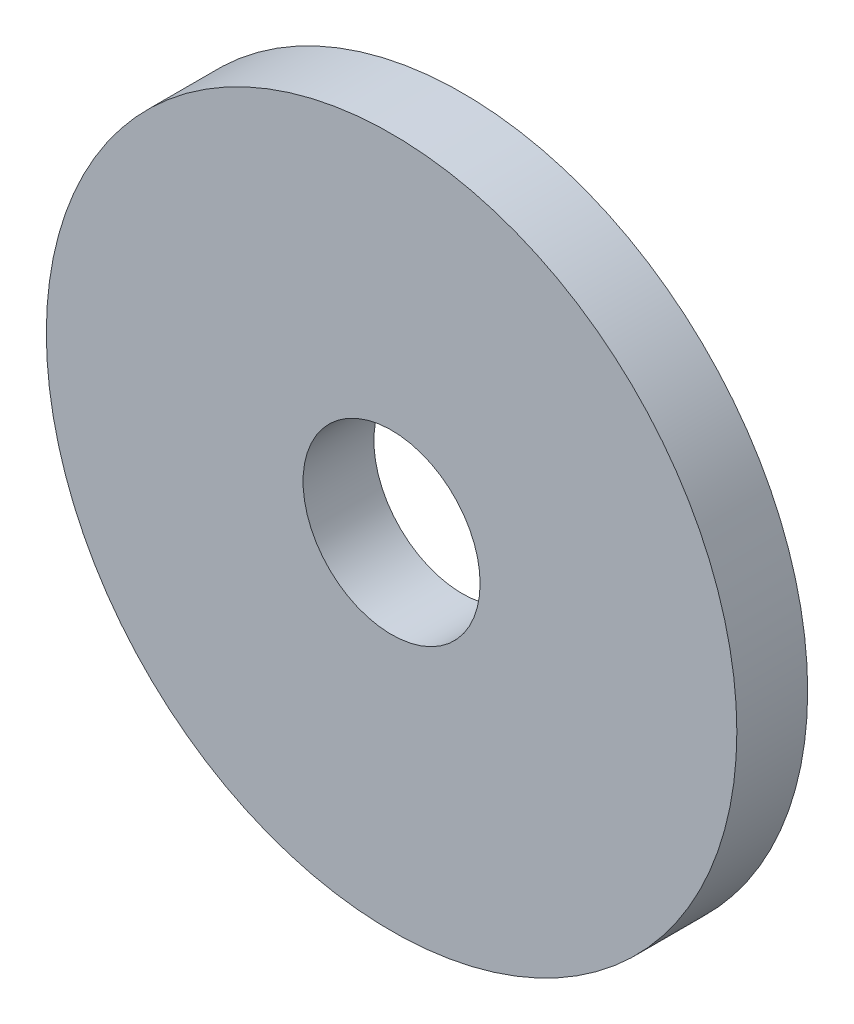
ISO-10303-21;
HEADER;
FILE_DESCRIPTION(('STEP AP214'),'2;1');
FILE_NAME('part.step','',(''),(''),'','','');
FILE_SCHEMA(('AUTOMOTIVE_DESIGN { 1 0 10303 214 1 1 1 1 }'));
ENDSEC;
DATA;
#1=APPLICATION_CONTEXT('core data for automotive mechanical design processes');
#2=APPLICATION_PROTOCOL_DEFINITION('international standard','automotive_design',2000,#1);
#3=PRODUCT_CONTEXT('',#1,'mechanical');
#4=PRODUCT('Part','Part','',(#3));
#5=PRODUCT_RELATED_PRODUCT_CATEGORY('part','',(#4));
#6=PRODUCT_DEFINITION_FORMATION('','',#4);
#7=PRODUCT_DEFINITION_CONTEXT('part definition',#1,'design');
#8=PRODUCT_DEFINITION('design','',#6,#7);
#9=PRODUCT_DEFINITION_SHAPE('','',#8);
#10=(LENGTH_UNIT() NAMED_UNIT(*) SI_UNIT(.MILLI.,.METRE.));
#11=(NAMED_UNIT(*) PLANE_ANGLE_UNIT() SI_UNIT($,.RADIAN.));
#12=(NAMED_UNIT(*) SI_UNIT($,.STERADIAN.) SOLID_ANGLE_UNIT());
#13=UNCERTAINTY_MEASURE_WITH_UNIT(LENGTH_MEASURE(1.E-05),#10,'distance_accuracy_value','');
#14=(GEOMETRIC_REPRESENTATION_CONTEXT(3) GLOBAL_UNCERTAINTY_ASSIGNED_CONTEXT((#13)) GLOBAL_UNIT_ASSIGNED_CONTEXT((#10,
#11,#12)) REPRESENTATION_CONTEXT('',''));
#15=CARTESIAN_POINT('',(0.,0.,0.));
#16=DIRECTION('',(0.,0.,1.));
#17=DIRECTION('',(1.,0.,0.));
#18=AXIS2_PLACEMENT_3D('',#15,#16,#17);
#19=CARTESIAN_POINT('',(0.,0.,1.2));
#20=DIRECTION('',(0.,0.,1.));
#21=DIRECTION('',(1.,0.,0.));
#22=AXIS2_PLACEMENT_3D('',#19,#20,#21);
#23=PLANE('',#22);
#24=CARTESIAN_POINT('',(0.,0.,1.2));
#25=DIRECTION('',(0.,0.,1.));
#26=DIRECTION('',(1.,0.,0.));
#27=AXIS2_PLACEMENT_3D('',#24,#25,#26);
#28=CIRCLE('',#27,5.85);
#29=CARTESIAN_POINT('',(5.85,0.,1.2));
#30=VERTEX_POINT('',#29);
#31=EDGE_CURVE('E10',#30,#30,#28,.T.);
#32=ORIENTED_EDGE('',*,*,#31,.T.);
#33=EDGE_LOOP('',(#32));
#34=FACE_BOUND('',#33,.T.);
#35=CARTESIAN_POINT('',(0.,0.,1.2));
#36=DIRECTION('',(0.,0.,1.));
#37=DIRECTION('',(1.,0.,0.));
#38=AXIS2_PLACEMENT_3D('',#35,#36,#37);
#39=CIRCLE('',#38,1.5);
#40=CARTESIAN_POINT('',(1.5,0.,1.2));
#41=VERTEX_POINT('',#40);
#42=EDGE_CURVE('E44',#41,#41,#39,.T.);
#43=ORIENTED_EDGE('',*,*,#42,.F.);
#44=EDGE_LOOP('',(#43));
#45=FACE_BOUND('',#44,.T.);
#46=ADVANCED_FACE('F33',(#34,#45),#23,.T.);
#47=CARTESIAN_POINT('',(0.,0.,0.));
#48=DIRECTION('',(0.,0.,1.));
#49=DIRECTION('',(1.,0.,0.));
#50=AXIS2_PLACEMENT_3D('',#47,#48,#49);
#51=PLANE('',#50);
#52=CARTESIAN_POINT('',(0.,0.,0.));
#53=DIRECTION('',(0.,0.,1.));
#54=DIRECTION('',(1.,0.,0.));
#55=AXIS2_PLACEMENT_3D('',#52,#53,#54);
#56=CIRCLE('',#55,5.85);
#57=CARTESIAN_POINT('',(5.85,0.,0.));
#58=VERTEX_POINT('',#57);
#59=EDGE_CURVE('E37',#58,#58,#56,.T.);
#60=ORIENTED_EDGE('',*,*,#59,.F.);
#61=EDGE_LOOP('',(#60));
#62=FACE_BOUND('',#61,.T.);
#63=CARTESIAN_POINT('',(0.,0.,0.));
#64=DIRECTION('',(0.,0.,1.));
#65=DIRECTION('',(1.,0.,0.));
#66=AXIS2_PLACEMENT_3D('',#63,#64,#65);
#67=CIRCLE('',#66,1.5);
#68=CARTESIAN_POINT('',(1.5,0.,0.));
#69=VERTEX_POINT('',#68);
#70=EDGE_CURVE('E46',#69,#69,#67,.T.);
#71=ORIENTED_EDGE('',*,*,#70,.T.);
#72=EDGE_LOOP('',(#71));
#73=FACE_BOUND('',#72,.T.);
#74=ADVANCED_FACE('F56',(#62,#73),#51,.F.);
#75=CARTESIAN_POINT('',(0.,0.,1.2));
#76=DIRECTION('',(0.,0.,-1.));
#77=DIRECTION('',(-1.,0.,0.));
#78=AXIS2_PLACEMENT_3D('',#75,#76,#77);
#79=CYLINDRICAL_SURFACE('',#78,5.85);
#80=ORIENTED_EDGE('',*,*,#31,.F.);
#81=EDGE_LOOP('',(#80));
#82=FACE_BOUND('',#81,.T.);
#83=ORIENTED_EDGE('',*,*,#59,.T.);
#84=EDGE_LOOP('',(#83));
#85=FACE_BOUND('',#84,.T.);
#86=ADVANCED_FACE('F35',(#82,#85),#79,.T.);
#87=CARTESIAN_POINT('',(0.,0.,1.2));
#88=DIRECTION('',(0.,0.,-1.));
#89=DIRECTION('',(-1.,0.,0.));
#90=AXIS2_PLACEMENT_3D('',#87,#88,#89);
#91=CYLINDRICAL_SURFACE('',#90,1.5);
#92=ORIENTED_EDGE('',*,*,#42,.T.);
#93=EDGE_LOOP('',(#92));
#94=FACE_BOUND('',#93,.T.);
#95=ORIENTED_EDGE('',*,*,#70,.F.);
#96=EDGE_LOOP('',(#95));
#97=FACE_BOUND('',#96,.T.);
#98=ADVANCED_FACE('F52',(#94,#97),#91,.F.);
#99=CLOSED_SHELL('',(#46,#74,#86,#98));
#100=MANIFOLD_SOLID_BREP('B2',#99);
#101=ADVANCED_BREP_SHAPE_REPRESENTATION('',(#18,#100),#14);
#102=SHAPE_DEFINITION_REPRESENTATION(#9,#101);
ENDSEC;
END-ISO-10303-21;
